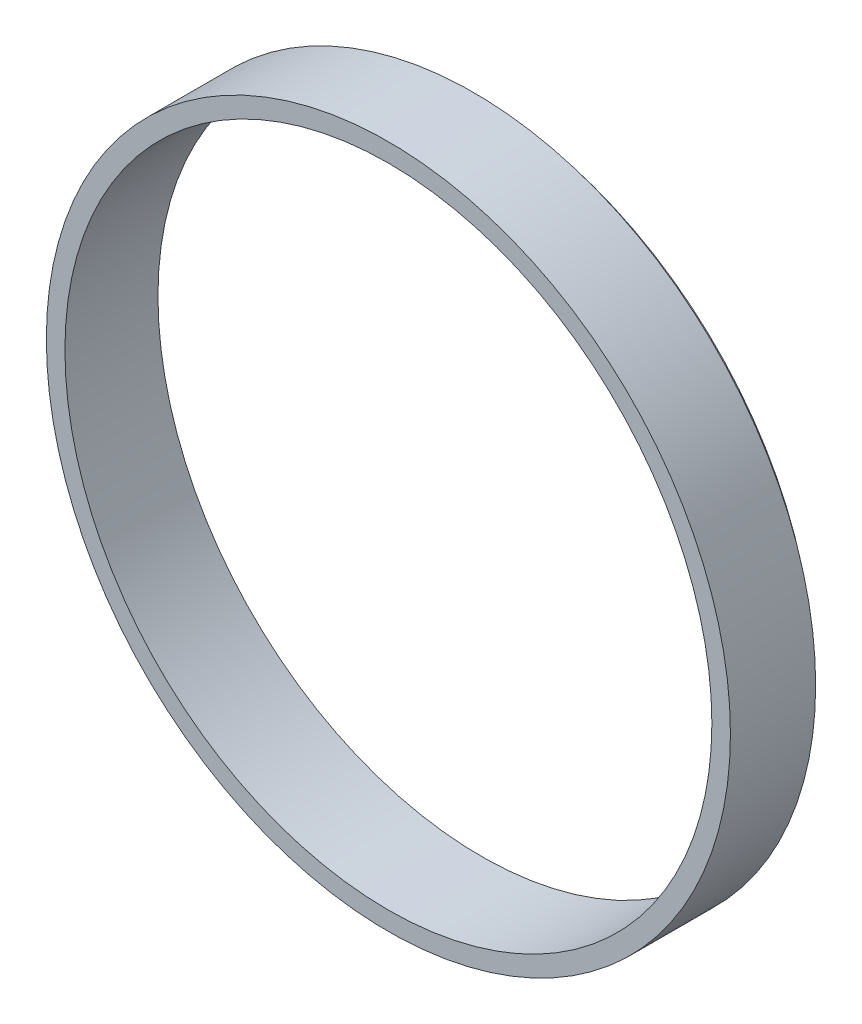
ISO-10303-21;
HEADER;
FILE_DESCRIPTION(('STEP AP214'),'2;1');
FILE_NAME('part.step','',(''),(''),'','','');
FILE_SCHEMA(('AUTOMOTIVE_DESIGN { 1 0 10303 214 1 1 1 1 }'));
ENDSEC;
DATA;
#1=APPLICATION_CONTEXT('core data for automotive mechanical design processes');
#2=APPLICATION_PROTOCOL_DEFINITION('international standard','automotive_design',2000,#1);
#3=PRODUCT_CONTEXT('',#1,'mechanical');
#4=PRODUCT('Part','Part','',(#3));
#5=PRODUCT_RELATED_PRODUCT_CATEGORY('part','',(#4));
#6=PRODUCT_DEFINITION_FORMATION('','',#4);
#7=PRODUCT_DEFINITION_CONTEXT('part definition',#1,'design');
#8=PRODUCT_DEFINITION('design','',#6,#7);
#9=PRODUCT_DEFINITION_SHAPE('','',#8);
#10=(LENGTH_UNIT() NAMED_UNIT(*) SI_UNIT(.MILLI.,.METRE.));
#11=(NAMED_UNIT(*) PLANE_ANGLE_UNIT() SI_UNIT($,.RADIAN.));
#12=(NAMED_UNIT(*) SI_UNIT($,.STERADIAN.) SOLID_ANGLE_UNIT());
#13=UNCERTAINTY_MEASURE_WITH_UNIT(LENGTH_MEASURE(1.E-05),#10,'distance_accuracy_value','');
#14=(GEOMETRIC_REPRESENTATION_CONTEXT(3) GLOBAL_UNCERTAINTY_ASSIGNED_CONTEXT((#13)) GLOBAL_UNIT_ASSIGNED_CONTEXT((#10,
#11,#12)) REPRESENTATION_CONTEXT('',''));
#15=CARTESIAN_POINT('',(0.,0.,0.));
#16=DIRECTION('',(0.,0.,1.));
#17=DIRECTION('',(1.,0.,0.));
#18=AXIS2_PLACEMENT_3D('',#15,#16,#17);
#19=CARTESIAN_POINT('',(0.,0.,269.287373415292));
#20=DIRECTION('',(0.,0.,-1.));
#21=DIRECTION('',(-1.,0.,0.));
#22=AXIS2_PLACEMENT_3D('',#19,#20,#21);
#23=CYLINDRICAL_SURFACE('',#22,87.5);
#24=CARTESIAN_POINT('',(0.,0.,0.));
#25=DIRECTION('',(0.,0.,1.));
#26=DIRECTION('',(1.,0.,0.));
#27=AXIS2_PLACEMENT_3D('',#24,#25,#26);
#28=CIRCLE('',#27,87.5);
#29=CARTESIAN_POINT('',(87.5,0.,0.));
#30=VERTEX_POINT('',#29);
#31=EDGE_CURVE('E34',#30,#30,#28,.T.);
#32=ORIENTED_EDGE('',*,*,#31,.T.);
#33=EDGE_LOOP('',(#32));
#34=FACE_BOUND('',#33,.T.);
#35=CARTESIAN_POINT('',(0.,0.,21.8));
#36=DIRECTION('',(0.,0.,1.));
#37=DIRECTION('',(1.,0.,0.));
#38=AXIS2_PLACEMENT_3D('',#35,#36,#37);
#39=CIRCLE('',#38,87.5);
#40=CARTESIAN_POINT('',(87.5,0.,21.8));
#41=VERTEX_POINT('',#40);
#42=EDGE_CURVE('E10',#41,#41,#39,.T.);
#43=ORIENTED_EDGE('',*,*,#42,.F.);
#44=EDGE_LOOP('',(#43));
#45=FACE_BOUND('',#44,.T.);
#46=ADVANCED_FACE('F31',(#34,#45),#23,.T.);
#47=CARTESIAN_POINT('',(0.,0.,0.));
#48=DIRECTION('',(0.,0.,1.));
#49=DIRECTION('',(1.,0.,0.));
#50=AXIS2_PLACEMENT_3D('',#47,#48,#49);
#51=PLANE('',#50);
#52=CARTESIAN_POINT('',(0.,0.,0.));
#53=DIRECTION('',(0.,0.,1.));
#54=DIRECTION('',(1.,0.,0.));
#55=AXIS2_PLACEMENT_3D('',#52,#53,#54);
#56=CIRCLE('',#55,85.);
#57=CARTESIAN_POINT('',(85.,0.,0.));
#58=VERTEX_POINT('',#57);
#59=EDGE_CURVE('E41',#58,#58,#56,.T.);
#60=ORIENTED_EDGE('',*,*,#59,.T.);
#61=EDGE_LOOP('',(#60));
#62=FACE_BOUND('',#61,.T.);
#63=ORIENTED_EDGE('',*,*,#31,.F.);
#64=EDGE_LOOP('',(#63));
#65=FACE_BOUND('',#64,.T.);
#66=ADVANCED_FACE('F69',(#62,#65),#51,.F.);
#67=CARTESIAN_POINT('',(0.,0.,21.8));
#68=DIRECTION('',(0.,0.,1.));
#69=DIRECTION('',(0.740185682275545,0.672402525095114,0.));
#70=AXIS2_PLACEMENT_3D('',#67,#68,#69);
#71=PLANE('',#70);
#72=ORIENTED_EDGE('',*,*,#42,.T.);
#73=EDGE_LOOP('',(#72));
#74=FACE_BOUND('',#73,.T.);
#75=CARTESIAN_POINT('',(0.,0.,21.8));
#76=DIRECTION('',(0.,0.,1.));
#77=DIRECTION('',(1.,0.,0.));
#78=AXIS2_PLACEMENT_3D('',#75,#76,#77);
#79=CIRCLE('',#78,82.75);
#80=CARTESIAN_POINT('',(82.75,0.,21.8));
#81=VERTEX_POINT('',#80);
#82=EDGE_CURVE('E45',#81,#81,#79,.F.);
#83=ORIENTED_EDGE('',*,*,#82,.T.);
#84=EDGE_LOOP('',(#83));
#85=FACE_BOUND('',#84,.T.);
#86=ADVANCED_FACE('F74',(#74,#85),#71,.T.);
#87=CARTESIAN_POINT('',(0.,0.,262.216305603426));
#88=DIRECTION('',(0.,0.,-1.));
#89=DIRECTION('',(-1.,0.,0.));
#90=AXIS2_PLACEMENT_3D('',#87,#88,#89);
#91=CYLINDRICAL_SURFACE('',#90,85.);
#92=CARTESIAN_POINT('',(0.,0.,-2.));
#93=DIRECTION('',(0.,0.,-1.));
#94=DIRECTION('',(-1.,0.,0.));
#95=AXIS2_PLACEMENT_3D('',#92,#93,#94);
#96=CIRCLE('',#95,85.);
#97=CARTESIAN_POINT('',(-85.,0.,-2.));
#98=VERTEX_POINT('',#97);
#99=EDGE_CURVE('E48',#98,#98,#96,.T.);
#100=ORIENTED_EDGE('',*,*,#99,.F.);
#101=EDGE_LOOP('',(#100));
#102=FACE_BOUND('',#101,.T.);
#103=ORIENTED_EDGE('',*,*,#59,.F.);
#104=EDGE_LOOP('',(#103));
#105=FACE_BOUND('',#104,.T.);
#106=ADVANCED_FACE('F64',(#102,#105),#91,.T.);
#107=CARTESIAN_POINT('',(0.,0.,262.216305603426));
#108=DIRECTION('',(0.,0.,-1.));
#109=DIRECTION('',(-1.,0.,0.));
#110=AXIS2_PLACEMENT_3D('',#107,#108,#109);
#111=CYLINDRICAL_SURFACE('',#110,82.75);
#112=ORIENTED_EDGE('',*,*,#82,.F.);
#113=EDGE_LOOP('',(#112));
#114=FACE_BOUND('',#113,.T.);
#115=CARTESIAN_POINT('',(0.,0.,-2.));
#116=DIRECTION('',(0.,0.,-1.));
#117=DIRECTION('',(-1.,0.,0.));
#118=AXIS2_PLACEMENT_3D('',#115,#116,#117);
#119=CIRCLE('',#118,82.75);
#120=CARTESIAN_POINT('',(-82.75,0.,-2.));
#121=VERTEX_POINT('',#120);
#122=EDGE_CURVE('E51',#121,#121,#119,.T.);
#123=ORIENTED_EDGE('',*,*,#122,.T.);
#124=EDGE_LOOP('',(#123));
#125=FACE_BOUND('',#124,.T.);
#126=ADVANCED_FACE('F55',(#114,#125),#111,.F.);
#127=CARTESIAN_POINT('',(0.,0.,-2.));
#128=DIRECTION('',(0.,0.,-1.));
#129=DIRECTION('',(-1.,0.,0.));
#130=AXIS2_PLACEMENT_3D('',#127,#128,#129);
#131=PLANE('',#130);
#132=ORIENTED_EDGE('',*,*,#99,.T.);
#133=EDGE_LOOP('',(#132));
#134=FACE_BOUND('',#133,.T.);
#135=ORIENTED_EDGE('',*,*,#122,.F.);
#136=EDGE_LOOP('',(#135));
#137=FACE_BOUND('',#136,.T.);
#138=ADVANCED_FACE('F57',(#134,#137),#131,.T.);
#139=CLOSED_SHELL('',(#46,#66,#86,#106,#126,#138));
#140=MANIFOLD_SOLID_BREP('B2',#139);
#141=ADVANCED_BREP_SHAPE_REPRESENTATION('',(#18,#140),#14);
#142=SHAPE_DEFINITION_REPRESENTATION(#9,#141);
ENDSEC;
END-ISO-10303-21;
